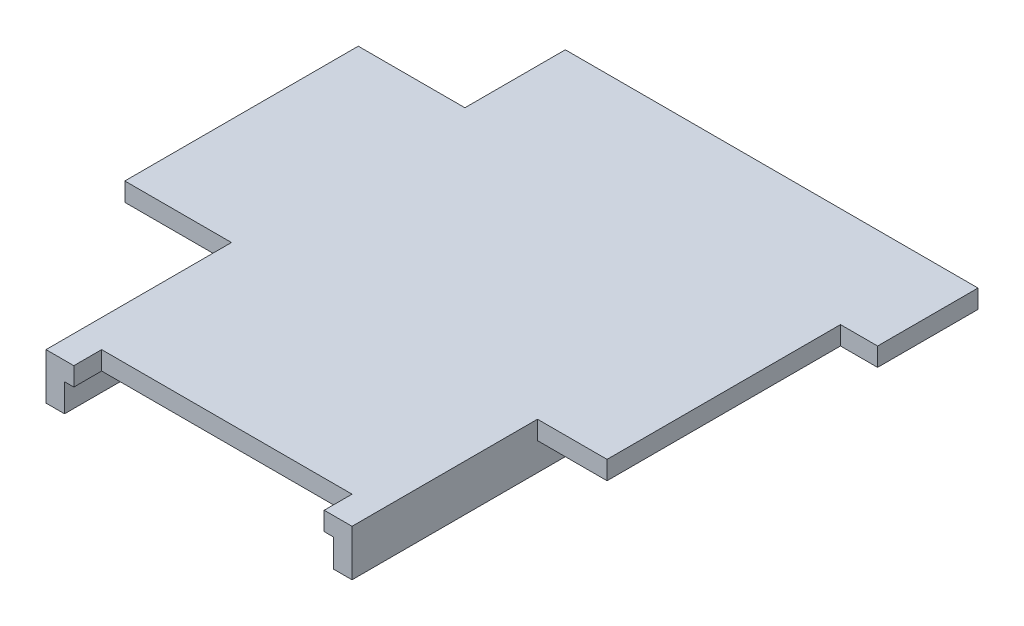
ISO-10303-21;
HEADER;
FILE_DESCRIPTION(('STEP AP214'),'2;1');
FILE_NAME('part.step','',(''),(''),'','','');
FILE_SCHEMA(('AUTOMOTIVE_DESIGN { 1 0 10303 214 1 1 1 1 }'));
ENDSEC;
DATA;
#1=APPLICATION_CONTEXT('core data for automotive mechanical design processes');
#2=APPLICATION_PROTOCOL_DEFINITION('international standard','automotive_design',2000,#1);
#3=PRODUCT_CONTEXT('',#1,'mechanical');
#4=PRODUCT('Part','Part','',(#3));
#5=PRODUCT_RELATED_PRODUCT_CATEGORY('part','',(#4));
#6=PRODUCT_DEFINITION_FORMATION('','',#4);
#7=PRODUCT_DEFINITION_CONTEXT('part definition',#1,'design');
#8=PRODUCT_DEFINITION('design','',#6,#7);
#9=PRODUCT_DEFINITION_SHAPE('','',#8);
#10=(LENGTH_UNIT() NAMED_UNIT(*) SI_UNIT(.MILLI.,.METRE.));
#11=(NAMED_UNIT(*) PLANE_ANGLE_UNIT() SI_UNIT($,.RADIAN.));
#12=(NAMED_UNIT(*) SI_UNIT($,.STERADIAN.) SOLID_ANGLE_UNIT());
#13=UNCERTAINTY_MEASURE_WITH_UNIT(LENGTH_MEASURE(1.E-05),#10,'distance_accuracy_value','');
#14=(GEOMETRIC_REPRESENTATION_CONTEXT(3) GLOBAL_UNCERTAINTY_ASSIGNED_CONTEXT((#13)) GLOBAL_UNIT_ASSIGNED_CONTEXT((#10,
#11,#12)) REPRESENTATION_CONTEXT('',''));
#15=CARTESIAN_POINT('',(0.,0.,0.));
#16=DIRECTION('',(0.,0.,1.));
#17=DIRECTION('',(1.,0.,0.));
#18=AXIS2_PLACEMENT_3D('',#15,#16,#17);
#19=CARTESIAN_POINT('',(0.,0.,0.));
#20=DIRECTION('',(0.,1.,0.));
#21=DIRECTION('',(0.,0.,1.));
#22=AXIS2_PLACEMENT_3D('',#19,#20,#21);
#23=PLANE('',#22);
#24=DIRECTION('',(1.,0.,0.));
#25=VECTOR('',#24,1.);
#26=CARTESIAN_POINT('',(0.,0.,-56.4483598828676));
#27=LINE('',#26,#25);
#28=CARTESIAN_POINT('',(18.6,0.,-56.4483598828676));
#29=VERTEX_POINT('',#28);
#30=CARTESIAN_POINT('',(20.6,0.,-56.4483598828676));
#31=VERTEX_POINT('',#30);
#32=EDGE_CURVE('E49',#29,#31,#27,.T.);
#33=ORIENTED_EDGE('',*,*,#32,.F.);
#34=DIRECTION('',(0.,0.,-1.));
#35=VECTOR('',#34,1.);
#36=CARTESIAN_POINT('',(18.6,0.,0.));
#37=LINE('',#36,#35);
#38=CARTESIAN_POINT('',(18.6,0.,-59.4124614980054));
#39=VERTEX_POINT('',#38);
#40=EDGE_CURVE('E217',#29,#39,#37,.T.);
#41=ORIENTED_EDGE('',*,*,#40,.T.);
#42=DIRECTION('',(-1.,0.,0.));
#43=VECTOR('',#42,1.);
#44=CARTESIAN_POINT('',(7.10000000000003,0.,-59.4124614980054));
#45=LINE('',#44,#43);
#46=CARTESIAN_POINT('',(63.1,0.,-59.4124614980054));
#47=VERTEX_POINT('',#46);
#48=EDGE_CURVE('E388',#47,#39,#45,.T.);
#49=ORIENTED_EDGE('',*,*,#48,.F.);
#50=DIRECTION('',(0.,0.,-1.));
#51=VECTOR('',#50,1.);
#52=CARTESIAN_POINT('',(63.1,0.,-59.4124614980054));
#53=LINE('',#52,#51);
#54=CARTESIAN_POINT('',(63.1,0.,-48.5841541053301));
#55=VERTEX_POINT('',#54);
#56=EDGE_CURVE('E384',#55,#47,#53,.T.);
#57=ORIENTED_EDGE('',*,*,#56,.F.);
#58=DIRECTION('',(1.,0.,0.));
#59=VECTOR('',#58,1.);
#60=CARTESIAN_POINT('',(63.1,0.,-48.5841541053301));
#61=LINE('',#60,#59);
#62=CARTESIAN_POINT('',(59.1,0.,-48.5841541053301));
#63=VERTEX_POINT('',#62);
#64=EDGE_CURVE('E380',#63,#55,#61,.T.);
#65=ORIENTED_EDGE('',*,*,#64,.F.);
#66=DIRECTION('',(0.,0.,-1.));
#67=VECTOR('',#66,1.);
#68=CARTESIAN_POINT('',(59.1,0.,-48.5841541053301));
#69=LINE('',#68,#67);
#70=CARTESIAN_POINT('',(59.1,0.,-23.4124614980054));
#71=VERTEX_POINT('',#70);
#72=EDGE_CURVE('E377',#71,#63,#69,.T.);
#73=ORIENTED_EDGE('',*,*,#72,.F.);
#74=DIRECTION('',(1.,0.,0.));
#75=VECTOR('',#74,1.);
#76=CARTESIAN_POINT('',(49.6,0.,-23.4124614980054));
#77=LINE('',#76,#75);
#78=CARTESIAN_POINT('',(51.6,0.,-23.4124614980054));
#79=VERTEX_POINT('',#78);
#80=EDGE_CURVE('E374',#79,#71,#77,.T.);
#81=ORIENTED_EDGE('',*,*,#80,.F.);
#82=DIRECTION('',(0.,0.,-1.));
#83=VECTOR('',#82,1.);
#84=CARTESIAN_POINT('',(51.6,0.,0.));
#85=LINE('',#84,#83);
#86=CARTESIAN_POINT('',(51.6,0.,-56.4483598828676));
#87=VERTEX_POINT('',#86);
#88=EDGE_CURVE('E295',#79,#87,#85,.T.);
#89=ORIENTED_EDGE('',*,*,#88,.T.);
#90=DIRECTION('',(1.,0.,0.));
#91=VECTOR('',#90,1.);
#92=CARTESIAN_POINT('',(0.,0.,-56.4483598828676));
#93=LINE('',#92,#91);
#94=CARTESIAN_POINT('',(49.6,0.,-56.4483598828676));
#95=VERTEX_POINT('',#94);
#96=EDGE_CURVE('E299',#95,#87,#93,.T.);
#97=ORIENTED_EDGE('',*,*,#96,.F.);
#98=DIRECTION('',(0.,0.,-1.));
#99=VECTOR('',#98,1.);
#100=CARTESIAN_POINT('',(49.6,0.,-3.41246149800537));
#101=LINE('',#100,#99);
#102=CARTESIAN_POINT('',(49.6,0.,-3.41246149800537));
#103=VERTEX_POINT('',#102);
#104=EDGE_CURVE('E371',#103,#95,#101,.T.);
#105=ORIENTED_EDGE('',*,*,#104,.F.);
#106=DIRECTION('',(1.,0.,0.));
#107=VECTOR('',#106,1.);
#108=CARTESIAN_POINT('',(20.6,0.,-3.41246149800537));
#109=LINE('',#108,#107);
#110=CARTESIAN_POINT('',(48.6,0.,-3.41246149800537));
#111=VERTEX_POINT('',#110);
#112=EDGE_CURVE('E366',#111,#103,#109,.T.);
#113=ORIENTED_EDGE('',*,*,#112,.F.);
#114=DIRECTION('',(0.,0.,-1.));
#115=VECTOR('',#114,1.);
#116=CARTESIAN_POINT('',(48.6,0.,0.));
#117=LINE('',#116,#115);
#118=CARTESIAN_POINT('',(48.6,0.,-6.41246149800537));
#119=VERTEX_POINT('',#118);
#120=EDGE_CURVE('E254',#111,#119,#117,.T.);
#121=ORIENTED_EDGE('',*,*,#120,.T.);
#122=DIRECTION('',(-1.,0.,0.));
#123=VECTOR('',#122,1.);
#124=CARTESIAN_POINT('',(0.,0.,-6.41246149800537));
#125=LINE('',#124,#123);
#126=CARTESIAN_POINT('',(21.6,0.,-6.41246149800537));
#127=VERTEX_POINT('',#126);
#128=EDGE_CURVE('E246',#119,#127,#125,.T.);
#129=ORIENTED_EDGE('',*,*,#128,.T.);
#130=DIRECTION('',(0.,0.,1.));
#131=VECTOR('',#130,1.);
#132=CARTESIAN_POINT('',(21.6,0.,0.));
#133=LINE('',#132,#131);
#134=CARTESIAN_POINT('',(21.6,0.,-3.41246149800537));
#135=VERTEX_POINT('',#134);
#136=EDGE_CURVE('E250',#127,#135,#133,.T.);
#137=ORIENTED_EDGE('',*,*,#136,.T.);
#138=CARTESIAN_POINT('',(20.6,0.,-3.41246149800537));
#139=VERTEX_POINT('',#138);
#140=EDGE_CURVE('E367',#139,#135,#109,.T.);
#141=ORIENTED_EDGE('',*,*,#140,.F.);
#142=DIRECTION('',(0.,0.,1.));
#143=VECTOR('',#142,1.);
#144=CARTESIAN_POINT('',(20.6,0.,-3.41246149800537));
#145=LINE('',#144,#143);
#146=EDGE_CURVE('E336',#31,#139,#145,.T.);
#147=ORIENTED_EDGE('',*,*,#146,.F.);
#148=EDGE_LOOP('',(#33,#41,#49,#57,#65,#73,#81,#89,#97,#105,#113,#121,#129,#137,#141,#147));
#149=FACE_BOUND('',#148,.T.);
#150=ADVANCED_FACE('F40',(#149),#23,.F.);
#151=CARTESIAN_POINT('',(20.6,2.,-3.41246149800537));
#152=DIRECTION('',(0.,0.,-1.));
#153=DIRECTION('',(-1.,0.,0.));
#154=AXIS2_PLACEMENT_3D('',#151,#152,#153);
#155=PLANE('',#154);
#156=DIRECTION('',(1.,0.,0.));
#157=VECTOR('',#156,1.);
#158=CARTESIAN_POINT('',(20.6,2.,-3.41246149800537));
#159=LINE('',#158,#157);
#160=CARTESIAN_POINT('',(48.6,2.,-3.41246149800537));
#161=VERTEX_POINT('',#160);
#162=CARTESIAN_POINT('',(51.6,2.,-3.41246149800537));
#163=VERTEX_POINT('',#162);
#164=EDGE_CURVE('E342',#161,#163,#159,.T.);
#165=ORIENTED_EDGE('',*,*,#164,.F.);
#166=DIRECTION('',(0.,1.,0.));
#167=VECTOR('',#166,1.);
#168=CARTESIAN_POINT('',(48.6,-8.,-3.41246149800537));
#169=LINE('',#168,#167);
#170=EDGE_CURVE('E205',#111,#161,#169,.T.);
#171=ORIENTED_EDGE('',*,*,#170,.F.);
#172=ORIENTED_EDGE('',*,*,#112,.T.);
#173=DIRECTION('',(0.,-1.,0.));
#174=VECTOR('',#173,1.);
#175=CARTESIAN_POINT('',(49.6,2.,-3.41246149800537));
#176=LINE('',#175,#174);
#177=CARTESIAN_POINT('',(49.6,-3.00000000000001,-3.41246149800537));
#178=VERTEX_POINT('',#177);
#179=EDGE_CURVE('E258',#103,#178,#176,.T.);
#180=ORIENTED_EDGE('',*,*,#179,.T.);
#181=DIRECTION('',(-1.,0.,0.));
#182=VECTOR('',#181,1.);
#183=CARTESIAN_POINT('',(51.6,-3.00000000000001,-3.41246149800537));
#184=LINE('',#183,#182);
#185=CARTESIAN_POINT('',(51.6,-3.00000000000001,-3.41246149800537));
#186=VERTEX_POINT('',#185);
#187=EDGE_CURVE('E287',#186,#178,#184,.T.);
#188=ORIENTED_EDGE('',*,*,#187,.F.);
#189=DIRECTION('',(0.,-1.,0.));
#190=VECTOR('',#189,1.);
#191=CARTESIAN_POINT('',(51.6,2.,-3.41246149800537));
#192=LINE('',#191,#190);
#193=EDGE_CURVE('E259',#163,#186,#192,.T.);
#194=ORIENTED_EDGE('',*,*,#193,.F.);
#195=EDGE_LOOP('',(#165,#171,#172,#180,#188,#194));
#196=FACE_BOUND('',#195,.T.);
#197=ADVANCED_FACE('F472',(#196),#155,.F.);
#198=CARTESIAN_POINT('',(20.6,2.,-23.4124614980054));
#199=DIRECTION('',(0.,0.,-1.));
#200=DIRECTION('',(-1.,0.,0.));
#201=AXIS2_PLACEMENT_3D('',#198,#199,#200);
#202=PLANE('',#201);
#203=DIRECTION('',(0.,-1.,0.));
#204=VECTOR('',#203,1.);
#205=CARTESIAN_POINT('',(18.6,2.,-23.4124614980054));
#206=LINE('',#205,#204);
#207=CARTESIAN_POINT('',(18.6,2.,-23.4124614980054));
#208=VERTEX_POINT('',#207);
#209=CARTESIAN_POINT('',(18.6,0.,-23.4124614980054));
#210=VERTEX_POINT('',#209);
#211=EDGE_CURVE('E333',#208,#210,#206,.T.);
#212=ORIENTED_EDGE('',*,*,#211,.F.);
#213=DIRECTION('',(1.,0.,0.));
#214=VECTOR('',#213,1.);
#215=CARTESIAN_POINT('',(20.6,2.,-23.4124614980054));
#216=LINE('',#215,#214);
#217=CARTESIAN_POINT('',(7.10000000000003,2.,-23.4124614980054));
#218=VERTEX_POINT('',#217);
#219=EDGE_CURVE('E359',#218,#208,#216,.T.);
#220=ORIENTED_EDGE('',*,*,#219,.F.);
#221=DIRECTION('',(0.,-1.,0.));
#222=VECTOR('',#221,1.);
#223=CARTESIAN_POINT('',(7.10000000000003,2.,-23.4124614980054));
#224=LINE('',#223,#222);
#225=CARTESIAN_POINT('',(7.10000000000003,0.,-23.4124614980054));
#226=VERTEX_POINT('',#225);
#227=EDGE_CURVE('E363',#218,#226,#224,.T.);
#228=ORIENTED_EDGE('',*,*,#227,.T.);
#229=DIRECTION('',(1.,0.,0.));
#230=VECTOR('',#229,1.);
#231=CARTESIAN_POINT('',(20.6,0.,-23.4124614980054));
#232=LINE('',#231,#230);
#233=EDGE_CURVE('E395',#226,#210,#232,.T.);
#234=ORIENTED_EDGE('',*,*,#233,.T.);
#235=EDGE_LOOP('',(#212,#220,#228,#234));
#236=FACE_BOUND('',#235,.T.);
#237=ADVANCED_FACE('F505',(#236),#202,.F.);
#238=DIRECTION('',(0.,0.,1.));
#239=VECTOR('',#238,1.);
#240=CARTESIAN_POINT('',(7.10000000000003,0.,-56.4483598828676));
#241=LINE('',#240,#239);
#242=CARTESIAN_POINT('',(7.10000000000003,0.,-48.5841541053301));
#243=VERTEX_POINT('',#242);
#244=EDGE_CURVE('E392',#243,#226,#241,.T.);
#245=ORIENTED_EDGE('',*,*,#244,.F.);
#246=DIRECTION('',(1.,0.,0.));
#247=VECTOR('',#246,1.);
#248=CARTESIAN_POINT('',(0.,0.,-48.5841541053301));
#249=LINE('',#248,#247);
#250=CARTESIAN_POINT('',(18.6,0.,-48.5841541053301));
#251=VERTEX_POINT('',#250);
#252=EDGE_CURVE('E243',#243,#251,#249,.T.);
#253=ORIENTED_EDGE('',*,*,#252,.T.);
#254=DIRECTION('',(0.,0.,-1.));
#255=VECTOR('',#254,1.);
#256=CARTESIAN_POINT('',(18.6,0.,0.));
#257=LINE('',#256,#255);
#258=EDGE_CURVE('E11',#210,#251,#257,.T.);
#259=ORIENTED_EDGE('',*,*,#258,.F.);
#260=ORIENTED_EDGE('',*,*,#233,.F.);
#261=EDGE_LOOP('',(#245,#253,#259,#260));
#262=FACE_BOUND('',#261,.T.);
#263=ADVANCED_FACE('F501',(#262),#23,.F.);
#264=ORIENTED_EDGE('',*,*,#140,.T.);
#265=DIRECTION('',(0.,1.,0.));
#266=VECTOR('',#265,1.);
#267=CARTESIAN_POINT('',(21.6,-8.,-3.41246149800537));
#268=LINE('',#267,#266);
#269=CARTESIAN_POINT('',(21.6,2.,-3.41246149800537));
#270=VERTEX_POINT('',#269);
#271=EDGE_CURVE('E231',#135,#270,#268,.T.);
#272=ORIENTED_EDGE('',*,*,#271,.T.);
#273=CARTESIAN_POINT('',(18.6,2.,-3.41246149800537));
#274=VERTEX_POINT('',#273);
#275=EDGE_CURVE('E337',#274,#270,#159,.T.);
#276=ORIENTED_EDGE('',*,*,#275,.F.);
#277=DIRECTION('',(0.,1.,0.));
#278=VECTOR('',#277,1.);
#279=CARTESIAN_POINT('',(18.6,2.,-3.41246149800537));
#280=LINE('',#279,#278);
#281=CARTESIAN_POINT('',(18.6,-3.,-3.41246149800537));
#282=VERTEX_POINT('',#281);
#283=EDGE_CURVE('E303',#282,#274,#280,.T.);
#284=ORIENTED_EDGE('',*,*,#283,.F.);
#285=DIRECTION('',(1.,0.,0.));
#286=VECTOR('',#285,1.);
#287=CARTESIAN_POINT('',(18.6,-3.,-3.41246149800537));
#288=LINE('',#287,#286);
#289=CARTESIAN_POINT('',(20.6,-3.,-3.41246149800537));
#290=VERTEX_POINT('',#289);
#291=EDGE_CURVE('E317',#282,#290,#288,.T.);
#292=ORIENTED_EDGE('',*,*,#291,.T.);
#293=DIRECTION('',(0.,1.,0.));
#294=VECTOR('',#293,1.);
#295=CARTESIAN_POINT('',(20.6,2.,-3.41246149800537));
#296=LINE('',#295,#294);
#297=EDGE_CURVE('E302',#290,#139,#296,.T.);
#298=ORIENTED_EDGE('',*,*,#297,.T.);
#299=EDGE_LOOP('',(#264,#272,#276,#284,#292,#298));
#300=FACE_BOUND('',#299,.T.);
#301=ADVANCED_FACE('F42',(#300),#155,.F.);
#302=CARTESIAN_POINT('',(49.6,2.,-23.4124614980054));
#303=DIRECTION('',(0.,0.,-1.));
#304=DIRECTION('',(-1.,0.,0.));
#305=AXIS2_PLACEMENT_3D('',#302,#303,#304);
#306=PLANE('',#305);
#307=DIRECTION('',(1.,0.,0.));
#308=VECTOR('',#307,1.);
#309=CARTESIAN_POINT('',(49.6,2.,-23.4124614980054));
#310=LINE('',#309,#308);
#311=CARTESIAN_POINT('',(51.6,2.,-23.4124614980054));
#312=VERTEX_POINT('',#311);
#313=CARTESIAN_POINT('',(59.1,2.,-23.4124614980054));
#314=VERTEX_POINT('',#313);
#315=EDGE_CURVE('E341',#312,#314,#310,.T.);
#316=ORIENTED_EDGE('',*,*,#315,.F.);
#317=DIRECTION('',(0.,-1.,0.));
#318=VECTOR('',#317,1.);
#319=CARTESIAN_POINT('',(51.6,2.,-23.4124614980054));
#320=LINE('',#319,#318);
#321=EDGE_CURVE('E291',#312,#79,#320,.T.);
#322=ORIENTED_EDGE('',*,*,#321,.T.);
#323=ORIENTED_EDGE('',*,*,#80,.T.);
#324=DIRECTION('',(0.,-1.,0.));
#325=VECTOR('',#324,1.);
#326=CARTESIAN_POINT('',(59.1,2.,-23.4124614980054));
#327=LINE('',#326,#325);
#328=EDGE_CURVE('E414',#314,#71,#327,.T.);
#329=ORIENTED_EDGE('',*,*,#328,.F.);
#330=EDGE_LOOP('',(#316,#322,#323,#329));
#331=FACE_BOUND('',#330,.T.);
#332=ADVANCED_FACE('F459',(#331),#306,.F.);
#333=CARTESIAN_POINT('',(59.1,2.,-48.5841541053301));
#334=DIRECTION('',(-1.,0.,0.));
#335=DIRECTION('',(0.,0.,1.));
#336=AXIS2_PLACEMENT_3D('',#333,#334,#335);
#337=PLANE('',#336);
#338=ORIENTED_EDGE('',*,*,#72,.T.);
#339=DIRECTION('',(0.,-1.,0.));
#340=VECTOR('',#339,1.);
#341=CARTESIAN_POINT('',(59.1,2.,-48.5841541053301));
#342=LINE('',#341,#340);
#343=CARTESIAN_POINT('',(59.1,2.,-48.5841541053301));
#344=VERTEX_POINT('',#343);
#345=EDGE_CURVE('E410',#344,#63,#342,.T.);
#346=ORIENTED_EDGE('',*,*,#345,.F.);
#347=DIRECTION('',(0.,0.,-1.));
#348=VECTOR('',#347,1.);
#349=CARTESIAN_POINT('',(59.1,2.,-48.5841541053301));
#350=LINE('',#349,#348);
#351=EDGE_CURVE('E345',#314,#344,#350,.T.);
#352=ORIENTED_EDGE('',*,*,#351,.F.);
#353=ORIENTED_EDGE('',*,*,#328,.T.);
#354=EDGE_LOOP('',(#338,#346,#352,#353));
#355=FACE_BOUND('',#354,.T.);
#356=ADVANCED_FACE('F454',(#355),#337,.F.);
#357=CARTESIAN_POINT('',(63.1,2.,-48.5841541053301));
#358=DIRECTION('',(0.,0.,-1.));
#359=DIRECTION('',(-1.,0.,0.));
#360=AXIS2_PLACEMENT_3D('',#357,#358,#359);
#361=PLANE('',#360);
#362=ORIENTED_EDGE('',*,*,#64,.T.);
#363=DIRECTION('',(0.,-1.,0.));
#364=VECTOR('',#363,1.);
#365=CARTESIAN_POINT('',(63.1,2.,-48.5841541053301));
#366=LINE('',#365,#364);
#367=CARTESIAN_POINT('',(63.1,2.,-48.5841541053301));
#368=VERTEX_POINT('',#367);
#369=EDGE_CURVE('E406',#368,#55,#366,.T.);
#370=ORIENTED_EDGE('',*,*,#369,.F.);
#371=DIRECTION('',(1.,0.,0.));
#372=VECTOR('',#371,1.);
#373=CARTESIAN_POINT('',(63.1,2.,-48.5841541053301));
#374=LINE('',#373,#372);
#375=EDGE_CURVE('E348',#344,#368,#374,.T.);
#376=ORIENTED_EDGE('',*,*,#375,.F.);
#377=ORIENTED_EDGE('',*,*,#345,.T.);
#378=EDGE_LOOP('',(#362,#370,#376,#377));
#379=FACE_BOUND('',#378,.T.);
#380=ADVANCED_FACE('F449',(#379),#361,.F.);
#381=CARTESIAN_POINT('',(63.1,2.,-59.4124614980054));
#382=DIRECTION('',(-1.,0.,0.));
#383=DIRECTION('',(0.,0.,1.));
#384=AXIS2_PLACEMENT_3D('',#381,#382,#383);
#385=PLANE('',#384);
#386=ORIENTED_EDGE('',*,*,#56,.T.);
#387=DIRECTION('',(0.,-1.,0.));
#388=VECTOR('',#387,1.);
#389=CARTESIAN_POINT('',(63.1,2.,-59.4124614980054));
#390=LINE('',#389,#388);
#391=CARTESIAN_POINT('',(63.1,2.,-59.4124614980054));
#392=VERTEX_POINT('',#391);
#393=EDGE_CURVE('E402',#392,#47,#390,.T.);
#394=ORIENTED_EDGE('',*,*,#393,.F.);
#395=DIRECTION('',(0.,0.,-1.));
#396=VECTOR('',#395,1.);
#397=CARTESIAN_POINT('',(63.1,2.,-48.5841541053301));
#398=LINE('',#397,#396);
#399=EDGE_CURVE('E351',#368,#392,#398,.T.);
#400=ORIENTED_EDGE('',*,*,#399,.F.);
#401=ORIENTED_EDGE('',*,*,#369,.T.);
#402=EDGE_LOOP('',(#386,#394,#400,#401));
#403=FACE_BOUND('',#402,.T.);
#404=ADVANCED_FACE('F444',(#403),#385,.F.);
#405=CARTESIAN_POINT('',(7.10000000000003,2.,-59.4124614980054));
#406=DIRECTION('',(0.,0.,1.));
#407=DIRECTION('',(1.,0.,0.));
#408=AXIS2_PLACEMENT_3D('',#405,#406,#407);
#409=PLANE('',#408);
#410=ORIENTED_EDGE('',*,*,#48,.T.);
#411=DIRECTION('',(0.,1.,0.));
#412=VECTOR('',#411,1.);
#413=CARTESIAN_POINT('',(18.6,-8.,-59.4124614980054));
#414=LINE('',#413,#412);
#415=CARTESIAN_POINT('',(18.6,2.,-59.4124614980054));
#416=VERTEX_POINT('',#415);
#417=EDGE_CURVE('E198',#39,#416,#414,.T.);
#418=ORIENTED_EDGE('',*,*,#417,.T.);
#419=DIRECTION('',(-1.,0.,0.));
#420=VECTOR('',#419,1.);
#421=CARTESIAN_POINT('',(60.1358983848622,2.,-59.4124614980054));
#422=LINE('',#421,#420);
#423=EDGE_CURVE('E210',#392,#416,#422,.T.);
#424=ORIENTED_EDGE('',*,*,#423,.F.);
#425=ORIENTED_EDGE('',*,*,#393,.T.);
#426=EDGE_LOOP('',(#410,#418,#424,#425));
#427=FACE_BOUND('',#426,.T.);
#428=ADVANCED_FACE('F440',(#427),#409,.F.);
#429=CARTESIAN_POINT('',(7.10000000000003,2.,-56.4483598828676));
#430=DIRECTION('',(1.,0.,0.));
#431=DIRECTION('',(0.,0.,-1.));
#432=AXIS2_PLACEMENT_3D('',#429,#430,#431);
#433=PLANE('',#432);
#434=DIRECTION('',(0.,0.,1.));
#435=VECTOR('',#434,1.);
#436=CARTESIAN_POINT('',(7.10000000000003,2.,-56.4483598828676));
#437=LINE('',#436,#435);
#438=CARTESIAN_POINT('',(7.10000000000003,2.,-48.5841541053301));
#439=VERTEX_POINT('',#438);
#440=EDGE_CURVE('E356',#439,#218,#437,.T.);
#441=ORIENTED_EDGE('',*,*,#440,.F.);
#442=DIRECTION('',(0.,1.,0.));
#443=VECTOR('',#442,1.);
#444=CARTESIAN_POINT('',(7.10000000000003,-8.,-48.5841541053301));
#445=LINE('',#444,#443);
#446=EDGE_CURVE('E64',#243,#439,#445,.T.);
#447=ORIENTED_EDGE('',*,*,#446,.F.);
#448=ORIENTED_EDGE('',*,*,#244,.T.);
#449=ORIENTED_EDGE('',*,*,#227,.F.);
#450=EDGE_LOOP('',(#441,#447,#448,#449));
#451=FACE_BOUND('',#450,.T.);
#452=ADVANCED_FACE('F519',(#451),#433,.F.);
#453=CARTESIAN_POINT('',(0.,2.,0.));
#454=DIRECTION('',(0.,1.,0.));
#455=DIRECTION('',(0.,0.,1.));
#456=AXIS2_PLACEMENT_3D('',#453,#454,#455);
#457=PLANE('',#456);
#458=DIRECTION('',(0.,0.,-1.));
#459=VECTOR('',#458,1.);
#460=CARTESIAN_POINT('',(18.6,2.,-59.4124614980054));
#461=LINE('',#460,#459);
#462=CARTESIAN_POINT('',(18.6,2.,-48.5841541053301));
#463=VERTEX_POINT('',#462);
#464=EDGE_CURVE('E193',#463,#416,#461,.T.);
#465=ORIENTED_EDGE('',*,*,#464,.F.);
#466=DIRECTION('',(1.,0.,0.));
#467=VECTOR('',#466,1.);
#468=CARTESIAN_POINT('',(7.10000000000003,2.,-48.5841541053301));
#469=LINE('',#468,#467);
#470=EDGE_CURVE('E200',#439,#463,#469,.T.);
#471=ORIENTED_EDGE('',*,*,#470,.F.);
#472=ORIENTED_EDGE('',*,*,#440,.T.);
#473=ORIENTED_EDGE('',*,*,#219,.T.);
#474=DIRECTION('',(0.,0.,-1.));
#475=VECTOR('',#474,1.);
#476=CARTESIAN_POINT('',(18.6,2.,-3.41246149800537));
#477=LINE('',#476,#475);
#478=EDGE_CURVE('E307',#274,#208,#477,.T.);
#479=ORIENTED_EDGE('',*,*,#478,.F.);
#480=ORIENTED_EDGE('',*,*,#275,.T.);
#481=DIRECTION('',(0.,0.,1.));
#482=VECTOR('',#481,1.);
#483=CARTESIAN_POINT('',(21.6,2.,-3.41246149800537));
#484=LINE('',#483,#482);
#485=CARTESIAN_POINT('',(21.6,2.,-6.41246149800537));
#486=VERTEX_POINT('',#485);
#487=EDGE_CURVE('E225',#486,#270,#484,.T.);
#488=ORIENTED_EDGE('',*,*,#487,.F.);
#489=DIRECTION('',(-1.,0.,0.));
#490=VECTOR('',#489,1.);
#491=CARTESIAN_POINT('',(48.6,2.,-6.41246149800537));
#492=LINE('',#491,#490);
#493=CARTESIAN_POINT('',(48.6,2.,-6.41246149800537));
#494=VERTEX_POINT('',#493);
#495=EDGE_CURVE('E221',#494,#486,#492,.T.);
#496=ORIENTED_EDGE('',*,*,#495,.F.);
#497=DIRECTION('',(0.,0.,-1.));
#498=VECTOR('',#497,1.);
#499=CARTESIAN_POINT('',(48.6,2.,-3.41246149800537));
#500=LINE('',#499,#498);
#501=EDGE_CURVE('E56',#161,#494,#500,.T.);
#502=ORIENTED_EDGE('',*,*,#501,.F.);
#503=ORIENTED_EDGE('',*,*,#164,.T.);
#504=DIRECTION('',(0.,0.,1.));
#505=VECTOR('',#504,1.);
#506=CARTESIAN_POINT('',(51.6,2.,-3.41246149800537));
#507=LINE('',#506,#505);
#508=EDGE_CURVE('E271',#312,#163,#507,.T.);
#509=ORIENTED_EDGE('',*,*,#508,.F.);
#510=ORIENTED_EDGE('',*,*,#315,.T.);
#511=ORIENTED_EDGE('',*,*,#351,.T.);
#512=ORIENTED_EDGE('',*,*,#375,.T.);
#513=ORIENTED_EDGE('',*,*,#399,.T.);
#514=ORIENTED_EDGE('',*,*,#423,.T.);
#515=EDGE_LOOP('',(#465,#471,#472,#473,#479,#480,#488,#496,#502,#503,#509,#510,#511,#512,#513,#514));
#516=FACE_BOUND('',#515,.T.);
#517=ADVANCED_FACE('F208',(#516),#457,.T.);
#518=CARTESIAN_POINT('',(18.6,1.99999999999999,-56.4483598828676));
#519=DIRECTION('',(0.,0.,1.));
#520=DIRECTION('',(1.,0.,0.));
#521=AXIS2_PLACEMENT_3D('',#518,#519,#520);
#522=PLANE('',#521);
#523=DIRECTION('',(0.,-1.,0.));
#524=VECTOR('',#523,1.);
#525=CARTESIAN_POINT('',(18.6,1.99999999999999,-56.4483598828676));
#526=LINE('',#525,#524);
#527=CARTESIAN_POINT('',(18.6,-3.00000000000001,-56.4483598828676));
#528=VERTEX_POINT('',#527);
#529=EDGE_CURVE('E311',#29,#528,#526,.T.);
#530=ORIENTED_EDGE('',*,*,#529,.F.);
#531=ORIENTED_EDGE('',*,*,#32,.T.);
#532=DIRECTION('',(0.,-1.,0.));
#533=VECTOR('',#532,1.);
#534=CARTESIAN_POINT('',(20.6,1.99999999999999,-56.4483598828676));
#535=LINE('',#534,#533);
#536=CARTESIAN_POINT('',(20.6,-3.00000000000001,-56.4483598828676));
#537=VERTEX_POINT('',#536);
#538=EDGE_CURVE('E321',#31,#537,#535,.T.);
#539=ORIENTED_EDGE('',*,*,#538,.T.);
#540=DIRECTION('',(1.,0.,0.));
#541=VECTOR('',#540,1.);
#542=CARTESIAN_POINT('',(18.6,-3.00000000000001,-56.4483598828676));
#543=LINE('',#542,#541);
#544=EDGE_CURVE('E329',#528,#537,#543,.T.);
#545=ORIENTED_EDGE('',*,*,#544,.F.);
#546=EDGE_LOOP('',(#530,#531,#539,#545));
#547=FACE_BOUND('',#546,.T.);
#548=ADVANCED_FACE('F422',(#547),#522,.F.);
#549=CARTESIAN_POINT('',(18.6,0.,0.));
#550=DIRECTION('',(1.,0.,0.));
#551=DIRECTION('',(0.,0.,-1.));
#552=AXIS2_PLACEMENT_3D('',#549,#550,#551);
#553=PLANE('',#552);
#554=ORIENTED_EDGE('',*,*,#258,.T.);
#555=DIRECTION('',(0.,1.,0.));
#556=VECTOR('',#555,1.);
#557=CARTESIAN_POINT('',(18.6,-8.,-48.5841541053301));
#558=LINE('',#557,#556);
#559=EDGE_CURVE('E190',#251,#463,#558,.T.);
#560=ORIENTED_EDGE('',*,*,#559,.T.);
#561=ORIENTED_EDGE('',*,*,#464,.T.);
#562=ORIENTED_EDGE('',*,*,#417,.F.);
#563=ORIENTED_EDGE('',*,*,#40,.F.);
#564=ORIENTED_EDGE('',*,*,#529,.T.);
#565=DIRECTION('',(0.,0.,1.));
#566=VECTOR('',#565,1.);
#567=CARTESIAN_POINT('',(18.6,-3.,-3.41246149800537));
#568=LINE('',#567,#566);
#569=EDGE_CURVE('E314',#528,#282,#568,.T.);
#570=ORIENTED_EDGE('',*,*,#569,.T.);
#571=ORIENTED_EDGE('',*,*,#283,.T.);
#572=ORIENTED_EDGE('',*,*,#478,.T.);
#573=ORIENTED_EDGE('',*,*,#211,.T.);
#574=EDGE_LOOP('',(#554,#560,#561,#562,#563,#564,#570,#571,#572,#573));
#575=FACE_BOUND('',#574,.T.);
#576=ADVANCED_FACE('F191',(#575),#553,.F.);
#577=CARTESIAN_POINT('',(20.6,0.,0.));
#578=DIRECTION('',(1.,0.,0.));
#579=DIRECTION('',(0.,0.,-1.));
#580=AXIS2_PLACEMENT_3D('',#577,#578,#579);
#581=PLANE('',#580);
#582=ORIENTED_EDGE('',*,*,#146,.T.);
#583=ORIENTED_EDGE('',*,*,#297,.F.);
#584=DIRECTION('',(0.,0.,1.));
#585=VECTOR('',#584,1.);
#586=CARTESIAN_POINT('',(20.6,-3.,-3.41246149800537));
#587=LINE('',#586,#585);
#588=EDGE_CURVE('E308',#537,#290,#587,.T.);
#589=ORIENTED_EDGE('',*,*,#588,.F.);
#590=ORIENTED_EDGE('',*,*,#538,.F.);
#591=EDGE_LOOP('',(#582,#583,#589,#590));
#592=FACE_BOUND('',#591,.T.);
#593=ADVANCED_FACE('F430',(#592),#581,.T.);
#594=CARTESIAN_POINT('',(18.6,-3.,-3.41246149800537));
#595=DIRECTION('',(0.,1.,0.));
#596=DIRECTION('',(0.,0.,1.));
#597=AXIS2_PLACEMENT_3D('',#594,#595,#596);
#598=PLANE('',#597);
#599=ORIENTED_EDGE('',*,*,#588,.T.);
#600=ORIENTED_EDGE('',*,*,#291,.F.);
#601=ORIENTED_EDGE('',*,*,#569,.F.);
#602=ORIENTED_EDGE('',*,*,#544,.T.);
#603=EDGE_LOOP('',(#599,#600,#601,#602));
#604=FACE_BOUND('',#603,.T.);
#605=ADVANCED_FACE('F433',(#604),#598,.F.);
#606=CARTESIAN_POINT('',(51.6,2.,-56.4483598828676));
#607=DIRECTION('',(0.,0.,1.));
#608=DIRECTION('',(1.,0.,0.));
#609=AXIS2_PLACEMENT_3D('',#606,#607,#608);
#610=PLANE('',#609);
#611=DIRECTION('',(0.,1.,0.));
#612=VECTOR('',#611,1.);
#613=CARTESIAN_POINT('',(49.6,2.,-56.4483598828676));
#614=LINE('',#613,#612);
#615=CARTESIAN_POINT('',(49.6,-3.00000000000001,-56.4483598828676));
#616=VERTEX_POINT('',#615);
#617=EDGE_CURVE('E264',#616,#95,#614,.T.);
#618=ORIENTED_EDGE('',*,*,#617,.T.);
#619=ORIENTED_EDGE('',*,*,#96,.T.);
#620=DIRECTION('',(0.,1.,0.));
#621=VECTOR('',#620,1.);
#622=CARTESIAN_POINT('',(51.6,2.,-56.4483598828676));
#623=LINE('',#622,#621);
#624=CARTESIAN_POINT('',(51.6,-3.00000000000001,-56.4483598828676));
#625=VERTEX_POINT('',#624);
#626=EDGE_CURVE('E267',#625,#87,#623,.T.);
#627=ORIENTED_EDGE('',*,*,#626,.F.);
#628=DIRECTION('',(-1.,0.,0.));
#629=VECTOR('',#628,1.);
#630=CARTESIAN_POINT('',(51.6,-3.00000000000001,-56.4483598828676));
#631=LINE('',#630,#629);
#632=EDGE_CURVE('E275',#625,#616,#631,.T.);
#633=ORIENTED_EDGE('',*,*,#632,.T.);
#634=EDGE_LOOP('',(#618,#619,#627,#633));
#635=FACE_BOUND('',#634,.T.);
#636=ADVANCED_FACE('F482',(#635),#610,.F.);
#637=CARTESIAN_POINT('',(51.6,0.,0.));
#638=DIRECTION('',(1.,0.,0.));
#639=DIRECTION('',(0.,0.,-1.));
#640=AXIS2_PLACEMENT_3D('',#637,#638,#639);
#641=PLANE('',#640);
#642=ORIENTED_EDGE('',*,*,#88,.F.);
#643=ORIENTED_EDGE('',*,*,#321,.F.);
#644=ORIENTED_EDGE('',*,*,#508,.T.);
#645=ORIENTED_EDGE('',*,*,#193,.T.);
#646=DIRECTION('',(0.,0.,-1.));
#647=VECTOR('',#646,1.);
#648=CARTESIAN_POINT('',(51.6,-3.00000000000001,-3.41246149800537));
#649=LINE('',#648,#647);
#650=EDGE_CURVE('E263',#186,#625,#649,.T.);
#651=ORIENTED_EDGE('',*,*,#650,.T.);
#652=ORIENTED_EDGE('',*,*,#626,.T.);
#653=EDGE_LOOP('',(#642,#643,#644,#645,#651,#652));
#654=FACE_BOUND('',#653,.T.);
#655=ADVANCED_FACE('F462',(#654),#641,.T.);
#656=CARTESIAN_POINT('',(49.6,0.,0.));
#657=DIRECTION('',(1.,0.,0.));
#658=DIRECTION('',(0.,0.,-1.));
#659=AXIS2_PLACEMENT_3D('',#656,#657,#658);
#660=PLANE('',#659);
#661=ORIENTED_EDGE('',*,*,#179,.F.);
#662=ORIENTED_EDGE('',*,*,#104,.T.);
#663=ORIENTED_EDGE('',*,*,#617,.F.);
#664=DIRECTION('',(0.,0.,-1.));
#665=VECTOR('',#664,1.);
#666=CARTESIAN_POINT('',(49.6,-3.00000000000001,-3.41246149800537));
#667=LINE('',#666,#665);
#668=EDGE_CURVE('E278',#178,#616,#667,.T.);
#669=ORIENTED_EDGE('',*,*,#668,.F.);
#670=EDGE_LOOP('',(#661,#662,#663,#669));
#671=FACE_BOUND('',#670,.T.);
#672=ADVANCED_FACE('F477',(#671),#660,.F.);
#673=CARTESIAN_POINT('',(51.6,-3.00000000000001,-3.41246149800537));
#674=DIRECTION('',(0.,1.,0.));
#675=DIRECTION('',(0.,0.,1.));
#676=AXIS2_PLACEMENT_3D('',#673,#674,#675);
#677=PLANE('',#676);
#678=ORIENTED_EDGE('',*,*,#668,.T.);
#679=ORIENTED_EDGE('',*,*,#632,.F.);
#680=ORIENTED_EDGE('',*,*,#650,.F.);
#681=ORIENTED_EDGE('',*,*,#187,.T.);
#682=EDGE_LOOP('',(#678,#679,#680,#681));
#683=FACE_BOUND('',#682,.T.);
#684=ADVANCED_FACE('F485',(#683),#677,.F.);
#685=CARTESIAN_POINT('',(48.6,-8.,-3.41246149800537));
#686=DIRECTION('',(1.,0.,0.));
#687=DIRECTION('',(0.,0.,-1.));
#688=AXIS2_PLACEMENT_3D('',#685,#686,#687);
#689=PLANE('',#688);
#690=ORIENTED_EDGE('',*,*,#170,.T.);
#691=ORIENTED_EDGE('',*,*,#501,.T.);
#692=DIRECTION('',(0.,1.,0.));
#693=VECTOR('',#692,1.);
#694=CARTESIAN_POINT('',(48.6,-8.,-6.41246149800537));
#695=LINE('',#694,#693);
#696=EDGE_CURVE('E228',#119,#494,#695,.T.);
#697=ORIENTED_EDGE('',*,*,#696,.F.);
#698=ORIENTED_EDGE('',*,*,#120,.F.);
#699=EDGE_LOOP('',(#690,#691,#697,#698));
#700=FACE_BOUND('',#699,.T.);
#701=ADVANCED_FACE('F487',(#700),#689,.F.);
#702=CARTESIAN_POINT('',(21.6,-8.,-3.41246149800537));
#703=DIRECTION('',(-1.,0.,0.));
#704=DIRECTION('',(0.,0.,1.));
#705=AXIS2_PLACEMENT_3D('',#702,#703,#704);
#706=PLANE('',#705);
#707=DIRECTION('',(0.,1.,0.));
#708=VECTOR('',#707,1.);
#709=CARTESIAN_POINT('',(21.6,-8.,-6.41246149800537));
#710=LINE('',#709,#708);
#711=EDGE_CURVE('E235',#127,#486,#710,.T.);
#712=ORIENTED_EDGE('',*,*,#711,.T.);
#713=ORIENTED_EDGE('',*,*,#487,.T.);
#714=ORIENTED_EDGE('',*,*,#271,.F.);
#715=ORIENTED_EDGE('',*,*,#136,.F.);
#716=EDGE_LOOP('',(#712,#713,#714,#715));
#717=FACE_BOUND('',#716,.T.);
#718=ADVANCED_FACE('F494',(#717),#706,.F.);
#719=CARTESIAN_POINT('',(48.6,-8.,-6.41246149800537));
#720=DIRECTION('',(0.,0.,-1.));
#721=DIRECTION('',(-1.,0.,0.));
#722=AXIS2_PLACEMENT_3D('',#719,#720,#721);
#723=PLANE('',#722);
#724=ORIENTED_EDGE('',*,*,#696,.T.);
#725=ORIENTED_EDGE('',*,*,#495,.T.);
#726=ORIENTED_EDGE('',*,*,#711,.F.);
#727=ORIENTED_EDGE('',*,*,#128,.F.);
#728=EDGE_LOOP('',(#724,#725,#726,#727));
#729=FACE_BOUND('',#728,.T.);
#730=ADVANCED_FACE('F525',(#729),#723,.F.);
#731=CARTESIAN_POINT('',(7.10000000000003,-8.,-48.5841541053301));
#732=DIRECTION('',(0.,0.,1.));
#733=DIRECTION('',(1.,0.,0.));
#734=AXIS2_PLACEMENT_3D('',#731,#732,#733);
#735=PLANE('',#734);
#736=ORIENTED_EDGE('',*,*,#446,.T.);
#737=ORIENTED_EDGE('',*,*,#470,.T.);
#738=ORIENTED_EDGE('',*,*,#559,.F.);
#739=ORIENTED_EDGE('',*,*,#252,.F.);
#740=EDGE_LOOP('',(#736,#737,#738,#739));
#741=FACE_BOUND('',#740,.T.);
#742=ADVANCED_FACE('F201',(#741),#735,.F.);
#743=CLOSED_SHELL('',(#150,#197,#237,#263,#301,#332,#356,#380,#404,#428,#452,#517,#548,#576,
#593,#605,#636,#655,#672,#684,#701,#718,#730,#742));
#744=MANIFOLD_SOLID_BREP('B2',#743);
#745=ADVANCED_BREP_SHAPE_REPRESENTATION('',(#18,#744),#14);
#746=SHAPE_DEFINITION_REPRESENTATION(#9,#745);
ENDSEC;
END-ISO-10303-21;
